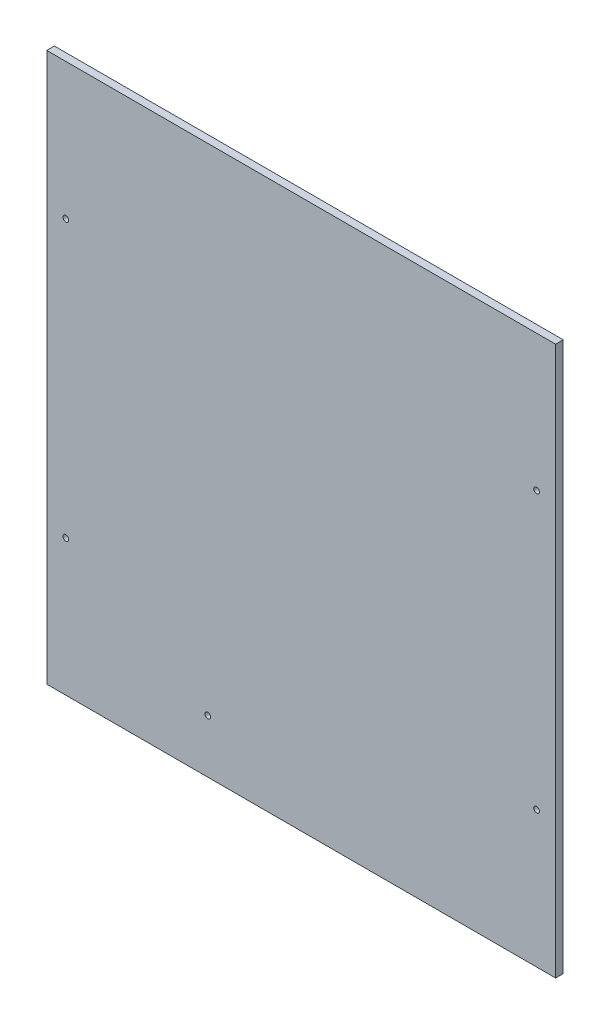
ISO-10303-21;
HEADER;
FILE_DESCRIPTION(('STEP AP214'),'2;1');
FILE_NAME('part.step','',(''),(''),'','','');
FILE_SCHEMA(('AUTOMOTIVE_DESIGN { 1 0 10303 214 1 1 1 1 }'));
ENDSEC;
DATA;
#1=APPLICATION_CONTEXT('core data for automotive mechanical design processes');
#2=APPLICATION_PROTOCOL_DEFINITION('international standard','automotive_design',2000,#1);
#3=PRODUCT_CONTEXT('',#1,'mechanical');
#4=PRODUCT('Part','Part','',(#3));
#5=PRODUCT_RELATED_PRODUCT_CATEGORY('part','',(#4));
#6=PRODUCT_DEFINITION_FORMATION('','',#4);
#7=PRODUCT_DEFINITION_CONTEXT('part definition',#1,'design');
#8=PRODUCT_DEFINITION('design','',#6,#7);
#9=PRODUCT_DEFINITION_SHAPE('','',#8);
#10=(LENGTH_UNIT() NAMED_UNIT(*) SI_UNIT(.MILLI.,.METRE.));
#11=(NAMED_UNIT(*) PLANE_ANGLE_UNIT() SI_UNIT($,.RADIAN.));
#12=(NAMED_UNIT(*) SI_UNIT($,.STERADIAN.) SOLID_ANGLE_UNIT());
#13=UNCERTAINTY_MEASURE_WITH_UNIT(LENGTH_MEASURE(1.E-05),#10,'distance_accuracy_value','');
#14=(GEOMETRIC_REPRESENTATION_CONTEXT(3) GLOBAL_UNCERTAINTY_ASSIGNED_CONTEXT((#13)) GLOBAL_UNIT_ASSIGNED_CONTEXT((#10,
#11,#12)) REPRESENTATION_CONTEXT('',''));
#15=CARTESIAN_POINT('',(0.,0.,0.));
#16=DIRECTION('',(0.,0.,1.));
#17=DIRECTION('',(1.,0.,0.));
#18=AXIS2_PLACEMENT_3D('',#15,#16,#17);
#19=CARTESIAN_POINT('',(-9.99999999999998,-34.3558338694737,4.));
#20=DIRECTION('',(0.,0.,1.));
#21=DIRECTION('',(1.,0.,0.));
#22=AXIS2_PLACEMENT_3D('',#19,#20,#21);
#23=PLANE('',#22);
#24=CARTESIAN_POINT('',(247.,182.144166130526,4.));
#25=DIRECTION('',(0.,0.,1.));
#26=DIRECTION('',(1.,0.,0.));
#27=AXIS2_PLACEMENT_3D('',#24,#25,#26);
#28=CIRCLE('',#27,1.50000000000002);
#29=CARTESIAN_POINT('',(248.5,182.144166130526,4.));
#30=VERTEX_POINT('',#29);
#31=EDGE_CURVE('E125',#30,#30,#28,.T.);
#32=ORIENTED_EDGE('',*,*,#31,.F.);
#33=EDGE_LOOP('',(#32));
#34=FACE_BOUND('',#33,.T.);
#35=CARTESIAN_POINT('',(0.,37.1441661305263,4.));
#36=DIRECTION('',(0.,0.,1.));
#37=DIRECTION('',(1.,0.,0.));
#38=AXIS2_PLACEMENT_3D('',#35,#36,#37);
#39=CIRCLE('',#38,1.5);
#40=CARTESIAN_POINT('',(1.50000000000002,37.1441661305263,4.));
#41=VERTEX_POINT('',#40);
#42=EDGE_CURVE('E113',#41,#41,#39,.T.);
#43=ORIENTED_EDGE('',*,*,#42,.F.);
#44=EDGE_LOOP('',(#43));
#45=FACE_BOUND('',#44,.T.);
#46=DIRECTION('',(0.,-1.,0.));
#47=VECTOR('',#46,1.);
#48=CARTESIAN_POINT('',(-10.,253.644166130526,4.));
#49=LINE('',#48,#47);
#50=CARTESIAN_POINT('',(-10.,253.644166130526,4.));
#51=VERTEX_POINT('',#50);
#52=CARTESIAN_POINT('',(-9.99999999999998,-34.3558338694737,4.));
#53=VERTEX_POINT('',#52);
#54=EDGE_CURVE('E83',#51,#53,#49,.T.);
#55=ORIENTED_EDGE('',*,*,#54,.T.);
#56=DIRECTION('',(1.,0.,0.));
#57=VECTOR('',#56,1.);
#58=CARTESIAN_POINT('',(-9.99999999999998,-34.3558338694737,4.));
#59=LINE('',#58,#57);
#60=CARTESIAN_POINT('',(257.,-34.3558338694737,4.));
#61=VERTEX_POINT('',#60);
#62=EDGE_CURVE('E78',#53,#61,#59,.T.);
#63=ORIENTED_EDGE('',*,*,#62,.T.);
#64=DIRECTION('',(0.,1.,0.));
#65=VECTOR('',#64,1.);
#66=CARTESIAN_POINT('',(257.,253.644166130526,4.));
#67=LINE('',#66,#65);
#68=CARTESIAN_POINT('',(257.,253.644166130526,4.));
#69=VERTEX_POINT('',#68);
#70=EDGE_CURVE('E81',#61,#69,#67,.T.);
#71=ORIENTED_EDGE('',*,*,#70,.T.);
#72=DIRECTION('',(-1.,0.,0.));
#73=VECTOR('',#72,1.);
#74=CARTESIAN_POINT('',(-10.,253.644166130526,4.));
#75=LINE('',#74,#73);
#76=EDGE_CURVE('E48',#69,#51,#75,.T.);
#77=ORIENTED_EDGE('',*,*,#76,.T.);
#78=EDGE_LOOP('',(#55,#63,#71,#77));
#79=FACE_BOUND('',#78,.T.);
#80=CARTESIAN_POINT('',(0.,182.144166130526,4.));
#81=DIRECTION('',(0.,0.,1.));
#82=DIRECTION('',(1.,0.,0.));
#83=AXIS2_PLACEMENT_3D('',#80,#81,#82);
#84=CIRCLE('',#83,1.5);
#85=CARTESIAN_POINT('',(1.5,182.144166130526,4.));
#86=VERTEX_POINT('',#85);
#87=EDGE_CURVE('E98',#86,#86,#84,.T.);
#88=ORIENTED_EDGE('',*,*,#87,.F.);
#89=EDGE_LOOP('',(#88));
#90=FACE_BOUND('',#89,.T.);
#91=CARTESIAN_POINT('',(247.,37.1441661305263,4.));
#92=DIRECTION('',(0.,0.,1.));
#93=DIRECTION('',(1.,0.,0.));
#94=AXIS2_PLACEMENT_3D('',#91,#92,#93);
#95=CIRCLE('',#94,1.50000000000003);
#96=CARTESIAN_POINT('',(248.5,37.1441661305263,4.));
#97=VERTEX_POINT('',#96);
#98=EDGE_CURVE('E119',#97,#97,#95,.T.);
#99=ORIENTED_EDGE('',*,*,#98,.F.);
#100=EDGE_LOOP('',(#99));
#101=FACE_BOUND('',#100,.T.);
#102=CARTESIAN_POINT('',(74.5,-6.35583386947364,4.));
#103=DIRECTION('',(0.,0.,1.));
#104=DIRECTION('',(1.,0.,0.));
#105=AXIS2_PLACEMENT_3D('',#102,#103,#104);
#106=CIRCLE('',#105,1.5);
#107=CARTESIAN_POINT('',(76.,-6.35583386947364,4.));
#108=VERTEX_POINT('',#107);
#109=EDGE_CURVE('E131',#108,#108,#106,.T.);
#110=ORIENTED_EDGE('',*,*,#109,.F.);
#111=EDGE_LOOP('',(#110));
#112=FACE_BOUND('',#111,.T.);
#113=ADVANCED_FACE('F31',(#34,#45,#79,#90,#101,#112),#23,.T.);
#114=CARTESIAN_POINT('',(-9.99999999999998,-34.3558338694737,0.));
#115=DIRECTION('',(0.,0.,1.));
#116=DIRECTION('',(1.,0.,0.));
#117=AXIS2_PLACEMENT_3D('',#114,#115,#116);
#118=PLANE('',#117);
#119=CARTESIAN_POINT('',(247.,182.144166130526,0.));
#120=DIRECTION('',(0.,0.,1.));
#121=DIRECTION('',(1.,0.,0.));
#122=AXIS2_PLACEMENT_3D('',#119,#120,#121);
#123=CIRCLE('',#122,1.50000000000002);
#124=CARTESIAN_POINT('',(248.5,182.144166130526,0.));
#125=VERTEX_POINT('',#124);
#126=EDGE_CURVE('E128',#125,#125,#123,.T.);
#127=ORIENTED_EDGE('',*,*,#126,.T.);
#128=EDGE_LOOP('',(#127));
#129=FACE_BOUND('',#128,.T.);
#130=CARTESIAN_POINT('',(0.,37.1441661305263,0.));
#131=DIRECTION('',(0.,0.,1.));
#132=DIRECTION('',(1.,0.,0.));
#133=AXIS2_PLACEMENT_3D('',#130,#131,#132);
#134=CIRCLE('',#133,1.5);
#135=CARTESIAN_POINT('',(1.50000000000002,37.1441661305263,0.));
#136=VERTEX_POINT('',#135);
#137=EDGE_CURVE('E116',#136,#136,#134,.T.);
#138=ORIENTED_EDGE('',*,*,#137,.T.);
#139=EDGE_LOOP('',(#138));
#140=FACE_BOUND('',#139,.T.);
#141=DIRECTION('',(0.,-1.,0.));
#142=VECTOR('',#141,1.);
#143=CARTESIAN_POINT('',(-10.,253.644166130526,0.));
#144=LINE('',#143,#142);
#145=CARTESIAN_POINT('',(-10.,253.644166130526,0.));
#146=VERTEX_POINT('',#145);
#147=CARTESIAN_POINT('',(-9.99999999999998,-34.3558338694737,0.));
#148=VERTEX_POINT('',#147);
#149=EDGE_CURVE('E95',#146,#148,#144,.T.);
#150=ORIENTED_EDGE('',*,*,#149,.F.);
#151=DIRECTION('',(-1.,0.,0.));
#152=VECTOR('',#151,1.);
#153=CARTESIAN_POINT('',(-10.,253.644166130526,0.));
#154=LINE('',#153,#152);
#155=CARTESIAN_POINT('',(257.,253.644166130526,0.));
#156=VERTEX_POINT('',#155);
#157=EDGE_CURVE('E71',#156,#146,#154,.T.);
#158=ORIENTED_EDGE('',*,*,#157,.F.);
#159=DIRECTION('',(0.,1.,0.));
#160=VECTOR('',#159,1.);
#161=CARTESIAN_POINT('',(257.,253.644166130526,0.));
#162=LINE('',#161,#160);
#163=CARTESIAN_POINT('',(257.,-34.3558338694737,0.));
#164=VERTEX_POINT('',#163);
#165=EDGE_CURVE('E65',#164,#156,#162,.T.);
#166=ORIENTED_EDGE('',*,*,#165,.F.);
#167=DIRECTION('',(1.,0.,0.));
#168=VECTOR('',#167,1.);
#169=CARTESIAN_POINT('',(-9.99999999999998,-34.3558338694737,0.));
#170=LINE('',#169,#168);
#171=EDGE_CURVE('E87',#148,#164,#170,.T.);
#172=ORIENTED_EDGE('',*,*,#171,.F.);
#173=EDGE_LOOP('',(#150,#158,#166,#172));
#174=FACE_BOUND('',#173,.T.);
#175=CARTESIAN_POINT('',(0.,182.144166130526,0.));
#176=DIRECTION('',(0.,0.,1.));
#177=DIRECTION('',(1.,0.,0.));
#178=AXIS2_PLACEMENT_3D('',#175,#176,#177);
#179=CIRCLE('',#178,1.5);
#180=CARTESIAN_POINT('',(1.5,182.144166130526,0.));
#181=VERTEX_POINT('',#180);
#182=EDGE_CURVE('E110',#181,#181,#179,.T.);
#183=ORIENTED_EDGE('',*,*,#182,.T.);
#184=EDGE_LOOP('',(#183));
#185=FACE_BOUND('',#184,.T.);
#186=CARTESIAN_POINT('',(247.,37.1441661305263,0.));
#187=DIRECTION('',(0.,0.,1.));
#188=DIRECTION('',(1.,0.,0.));
#189=AXIS2_PLACEMENT_3D('',#186,#187,#188);
#190=CIRCLE('',#189,1.50000000000003);
#191=CARTESIAN_POINT('',(248.5,37.1441661305263,0.));
#192=VERTEX_POINT('',#191);
#193=EDGE_CURVE('E122',#192,#192,#190,.T.);
#194=ORIENTED_EDGE('',*,*,#193,.T.);
#195=EDGE_LOOP('',(#194));
#196=FACE_BOUND('',#195,.T.);
#197=CARTESIAN_POINT('',(74.5,-6.35583386947364,0.));
#198=DIRECTION('',(0.,0.,1.));
#199=DIRECTION('',(1.,0.,0.));
#200=AXIS2_PLACEMENT_3D('',#197,#198,#199);
#201=CIRCLE('',#200,1.5);
#202=CARTESIAN_POINT('',(76.,-6.35583386947364,0.));
#203=VERTEX_POINT('',#202);
#204=EDGE_CURVE('E134',#203,#203,#201,.T.);
#205=ORIENTED_EDGE('',*,*,#204,.T.);
#206=EDGE_LOOP('',(#205));
#207=FACE_BOUND('',#206,.T.);
#208=ADVANCED_FACE('F106',(#129,#140,#174,#185,#196,#207),#118,.F.);
#209=CARTESIAN_POINT('',(-10.,253.644166130526,4.));
#210=DIRECTION('',(1.,0.,0.));
#211=DIRECTION('',(0.,1.,0.));
#212=AXIS2_PLACEMENT_3D('',#209,#210,#211);
#213=PLANE('',#212);
#214=ORIENTED_EDGE('',*,*,#149,.T.);
#215=DIRECTION('',(0.,0.,-1.));
#216=VECTOR('',#215,1.);
#217=CARTESIAN_POINT('',(-9.99999999999998,-34.3558338694737,4.));
#218=LINE('',#217,#216);
#219=EDGE_CURVE('E11',#53,#148,#218,.T.);
#220=ORIENTED_EDGE('',*,*,#219,.F.);
#221=ORIENTED_EDGE('',*,*,#54,.F.);
#222=DIRECTION('',(0.,0.,-1.));
#223=VECTOR('',#222,1.);
#224=CARTESIAN_POINT('',(-10.,253.644166130526,4.));
#225=LINE('',#224,#223);
#226=EDGE_CURVE('E91',#51,#146,#225,.T.);
#227=ORIENTED_EDGE('',*,*,#226,.T.);
#228=EDGE_LOOP('',(#214,#220,#221,#227));
#229=FACE_BOUND('',#228,.T.);
#230=ADVANCED_FACE('F33',(#229),#213,.F.);
#231=CARTESIAN_POINT('',(-9.99999999999998,-34.3558338694737,4.));
#232=DIRECTION('',(0.,1.,0.));
#233=DIRECTION('',(0.,0.,1.));
#234=AXIS2_PLACEMENT_3D('',#231,#232,#233);
#235=PLANE('',#234);
#236=ORIENTED_EDGE('',*,*,#171,.T.);
#237=DIRECTION('',(0.,0.,-1.));
#238=VECTOR('',#237,1.);
#239=CARTESIAN_POINT('',(257.,-34.3558338694737,4.));
#240=LINE('',#239,#238);
#241=EDGE_CURVE('E40',#61,#164,#240,.T.);
#242=ORIENTED_EDGE('',*,*,#241,.F.);
#243=ORIENTED_EDGE('',*,*,#62,.F.);
#244=ORIENTED_EDGE('',*,*,#219,.T.);
#245=EDGE_LOOP('',(#236,#242,#243,#244));
#246=FACE_BOUND('',#245,.T.);
#247=ADVANCED_FACE('F86',(#246),#235,.F.);
#248=CARTESIAN_POINT('',(257.,253.644166130526,4.));
#249=DIRECTION('',(-1.,0.,0.));
#250=DIRECTION('',(0.,-1.,0.));
#251=AXIS2_PLACEMENT_3D('',#248,#249,#250);
#252=PLANE('',#251);
#253=ORIENTED_EDGE('',*,*,#165,.T.);
#254=DIRECTION('',(0.,0.,-1.));
#255=VECTOR('',#254,1.);
#256=CARTESIAN_POINT('',(257.,253.644166130526,4.));
#257=LINE('',#256,#255);
#258=EDGE_CURVE('E88',#69,#156,#257,.T.);
#259=ORIENTED_EDGE('',*,*,#258,.F.);
#260=ORIENTED_EDGE('',*,*,#70,.F.);
#261=ORIENTED_EDGE('',*,*,#241,.T.);
#262=EDGE_LOOP('',(#253,#259,#260,#261));
#263=FACE_BOUND('',#262,.T.);
#264=ADVANCED_FACE('F89',(#263),#252,.F.);
#265=CARTESIAN_POINT('',(-10.,253.644166130526,4.));
#266=DIRECTION('',(0.,-1.,0.));
#267=DIRECTION('',(0.,0.,-1.));
#268=AXIS2_PLACEMENT_3D('',#265,#266,#267);
#269=PLANE('',#268);
#270=ORIENTED_EDGE('',*,*,#157,.T.);
#271=ORIENTED_EDGE('',*,*,#226,.F.);
#272=ORIENTED_EDGE('',*,*,#76,.F.);
#273=ORIENTED_EDGE('',*,*,#258,.T.);
#274=EDGE_LOOP('',(#270,#271,#272,#273));
#275=FACE_BOUND('',#274,.T.);
#276=ADVANCED_FACE('F103',(#275),#269,.F.);
#277=CARTESIAN_POINT('',(0.,182.144166130526,4.));
#278=DIRECTION('',(0.,0.,-1.));
#279=DIRECTION('',(-1.,0.,0.));
#280=AXIS2_PLACEMENT_3D('',#277,#278,#279);
#281=CYLINDRICAL_SURFACE('',#280,1.5);
#282=ORIENTED_EDGE('',*,*,#87,.T.);
#283=EDGE_LOOP('',(#282));
#284=FACE_BOUND('',#283,.T.);
#285=ORIENTED_EDGE('',*,*,#182,.F.);
#286=EDGE_LOOP('',(#285));
#287=FACE_BOUND('',#286,.T.);
#288=ADVANCED_FACE('F154',(#284,#287),#281,.F.);
#289=CARTESIAN_POINT('',(0.,37.1441661305263,4.));
#290=DIRECTION('',(0.,0.,-1.));
#291=DIRECTION('',(-1.,0.,0.));
#292=AXIS2_PLACEMENT_3D('',#289,#290,#291);
#293=CYLINDRICAL_SURFACE('',#292,1.5);
#294=ORIENTED_EDGE('',*,*,#42,.T.);
#295=EDGE_LOOP('',(#294));
#296=FACE_BOUND('',#295,.T.);
#297=ORIENTED_EDGE('',*,*,#137,.F.);
#298=EDGE_LOOP('',(#297));
#299=FACE_BOUND('',#298,.T.);
#300=ADVANCED_FACE('F200',(#296,#299),#293,.F.);
#301=CARTESIAN_POINT('',(247.,37.1441661305263,4.));
#302=DIRECTION('',(0.,0.,-1.));
#303=DIRECTION('',(-1.,0.,0.));
#304=AXIS2_PLACEMENT_3D('',#301,#302,#303);
#305=CYLINDRICAL_SURFACE('',#304,1.50000000000003);
#306=ORIENTED_EDGE('',*,*,#98,.T.);
#307=EDGE_LOOP('',(#306));
#308=FACE_BOUND('',#307,.T.);
#309=ORIENTED_EDGE('',*,*,#193,.F.);
#310=EDGE_LOOP('',(#309));
#311=FACE_BOUND('',#310,.T.);
#312=ADVANCED_FACE('F208',(#308,#311),#305,.F.);
#313=CARTESIAN_POINT('',(247.,182.144166130526,4.));
#314=DIRECTION('',(0.,0.,-1.));
#315=DIRECTION('',(-1.,0.,0.));
#316=AXIS2_PLACEMENT_3D('',#313,#314,#315);
#317=CYLINDRICAL_SURFACE('',#316,1.50000000000002);
#318=ORIENTED_EDGE('',*,*,#31,.T.);
#319=EDGE_LOOP('',(#318));
#320=FACE_BOUND('',#319,.T.);
#321=ORIENTED_EDGE('',*,*,#126,.F.);
#322=EDGE_LOOP('',(#321));
#323=FACE_BOUND('',#322,.T.);
#324=ADVANCED_FACE('F216',(#320,#323),#317,.F.);
#325=CARTESIAN_POINT('',(74.5,-6.35583386947364,4.));
#326=DIRECTION('',(0.,0.,-1.));
#327=DIRECTION('',(-1.,0.,0.));
#328=AXIS2_PLACEMENT_3D('',#325,#326,#327);
#329=CYLINDRICAL_SURFACE('',#328,1.5);
#330=ORIENTED_EDGE('',*,*,#109,.T.);
#331=EDGE_LOOP('',(#330));
#332=FACE_BOUND('',#331,.T.);
#333=ORIENTED_EDGE('',*,*,#204,.F.);
#334=EDGE_LOOP('',(#333));
#335=FACE_BOUND('',#334,.T.);
#336=ADVANCED_FACE('F140',(#332,#335),#329,.F.);
#337=CLOSED_SHELL('',(#113,#208,#230,#247,#264,#276,#288,#300,#312,#324,#336));
#338=MANIFOLD_SOLID_BREP('B2',#337);
#339=ADVANCED_BREP_SHAPE_REPRESENTATION('',(#18,#338),#14);
#340=SHAPE_DEFINITION_REPRESENTATION(#9,#339);
ENDSEC;
END-ISO-10303-21;
